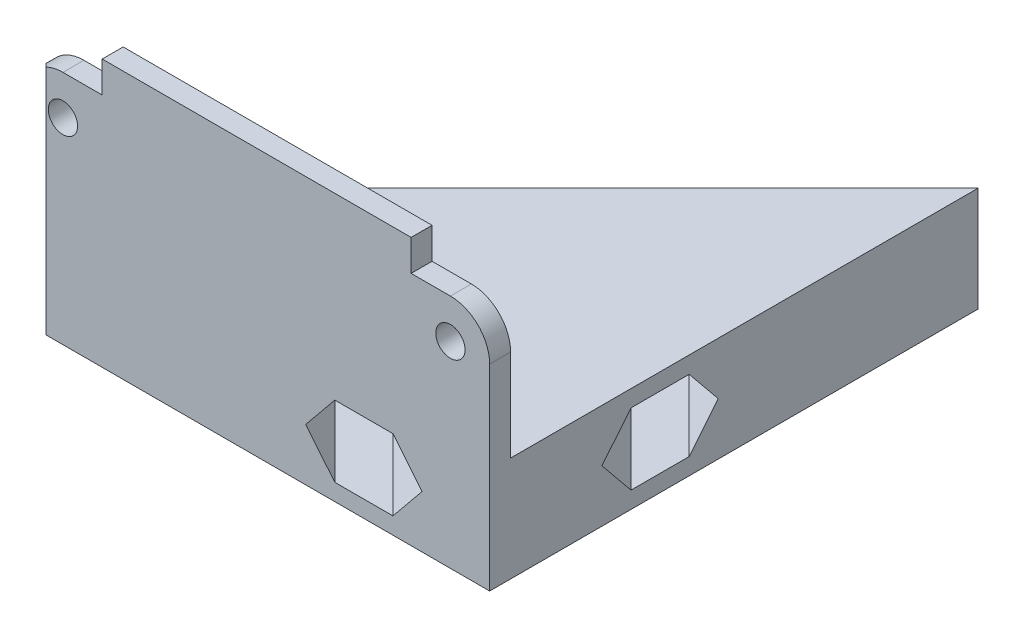
ISO-10303-21;
HEADER;
FILE_DESCRIPTION(('STEP AP214'),'2;1');
FILE_NAME('part.step','',(''),(''),'','','');
FILE_SCHEMA(('AUTOMOTIVE_DESIGN { 1 0 10303 214 1 1 1 1 }'));
ENDSEC;
DATA;
#1=APPLICATION_CONTEXT('core data for automotive mechanical design processes');
#2=APPLICATION_PROTOCOL_DEFINITION('international standard','automotive_design',2000,#1);
#3=PRODUCT_CONTEXT('',#1,'mechanical');
#4=PRODUCT('Part','Part','',(#3));
#5=PRODUCT_RELATED_PRODUCT_CATEGORY('part','',(#4));
#6=PRODUCT_DEFINITION_FORMATION('','',#4);
#7=PRODUCT_DEFINITION_CONTEXT('part definition',#1,'design');
#8=PRODUCT_DEFINITION('design','',#6,#7);
#9=PRODUCT_DEFINITION_SHAPE('','',#8);
#10=(LENGTH_UNIT() NAMED_UNIT(*) SI_UNIT(.MILLI.,.METRE.));
#11=(NAMED_UNIT(*) PLANE_ANGLE_UNIT() SI_UNIT($,.RADIAN.));
#12=(NAMED_UNIT(*) SI_UNIT($,.STERADIAN.) SOLID_ANGLE_UNIT());
#13=UNCERTAINTY_MEASURE_WITH_UNIT(LENGTH_MEASURE(1.E-05),#10,'distance_accuracy_value','');
#14=(GEOMETRIC_REPRESENTATION_CONTEXT(3) GLOBAL_UNCERTAINTY_ASSIGNED_CONTEXT((#13)) GLOBAL_UNIT_ASSIGNED_CONTEXT((#10,
#11,#12)) REPRESENTATION_CONTEXT('',''));
#15=CARTESIAN_POINT('',(0.,0.,0.));
#16=DIRECTION('',(0.,0.,1.));
#17=DIRECTION('',(1.,0.,0.));
#18=AXIS2_PLACEMENT_3D('',#15,#16,#17);
#19=CARTESIAN_POINT('',(3.75,6.27312353150441,2.));
#20=DIRECTION('',(0.,0.,-1.));
#21=DIRECTION('',(-1.,0.,0.));
#22=AXIS2_PLACEMENT_3D('',#19,#20,#21);
#23=CYLINDRICAL_SURFACE('',#22,3.75);
#24=CARTESIAN_POINT('',(3.75,6.27312353150441,0.));
#25=DIRECTION('',(0.,0.,1.));
#26=DIRECTION('',(1.,0.,0.));
#27=AXIS2_PLACEMENT_3D('',#24,#25,#26);
#28=CIRCLE('',#27,3.75);
#29=CARTESIAN_POINT('',(7.5,6.27312353150441,0.));
#30=VERTEX_POINT('',#29);
#31=CARTESIAN_POINT('',(3.75,10.0231235315044,0.));
#32=VERTEX_POINT('',#31);
#33=EDGE_CURVE('E258',#30,#32,#28,.T.);
#34=ORIENTED_EDGE('',*,*,#33,.T.);
#35=DIRECTION('',(0.,0.,-1.));
#36=VECTOR('',#35,1.);
#37=CARTESIAN_POINT('',(3.75,10.0231235315044,2.));
#38=LINE('',#37,#36);
#39=CARTESIAN_POINT('',(3.75,10.0231235315044,2.));
#40=VERTEX_POINT('',#39);
#41=EDGE_CURVE('E298',#40,#32,#38,.T.);
#42=ORIENTED_EDGE('',*,*,#41,.F.);
#43=CARTESIAN_POINT('',(3.75,6.27312353150441,2.));
#44=DIRECTION('',(0.,0.,1.));
#45=DIRECTION('',(1.,0.,0.));
#46=AXIS2_PLACEMENT_3D('',#43,#44,#45);
#47=CIRCLE('',#46,3.75);
#48=CARTESIAN_POINT('',(7.5,6.27312353150441,2.));
#49=VERTEX_POINT('',#48);
#50=EDGE_CURVE('E231',#49,#40,#47,.T.);
#51=ORIENTED_EDGE('',*,*,#50,.F.);
#52=DIRECTION('',(0.,0.,-1.));
#53=VECTOR('',#52,1.);
#54=CARTESIAN_POINT('',(7.5,6.27312353150441,2.));
#55=LINE('',#54,#53);
#56=EDGE_CURVE('E254',#49,#30,#55,.T.);
#57=ORIENTED_EDGE('',*,*,#56,.T.);
#58=EDGE_LOOP('',(#34,#42,#51,#57));
#59=FACE_BOUND('',#58,.T.);
#60=ADVANCED_FACE('F37',(#59),#23,.T.);
#61=CARTESIAN_POINT('',(0.,10.0231235315044,2.));
#62=DIRECTION('',(0.,-1.,0.));
#63=DIRECTION('',(1.,0.,0.));
#64=AXIS2_PLACEMENT_3D('',#61,#62,#63);
#65=PLANE('',#64);
#66=DIRECTION('',(-1.,0.,0.));
#67=VECTOR('',#66,1.);
#68=CARTESIAN_POINT('',(0.,10.0231235315044,0.));
#69=LINE('',#68,#67);
#70=CARTESIAN_POINT('',(0.,10.0231235315044,0.));
#71=VERTEX_POINT('',#70);
#72=EDGE_CURVE('E261',#32,#71,#69,.T.);
#73=ORIENTED_EDGE('',*,*,#72,.T.);
#74=DIRECTION('',(0.,0.,-1.));
#75=VECTOR('',#74,1.);
#76=CARTESIAN_POINT('',(0.,10.0231235315044,2.));
#77=LINE('',#76,#75);
#78=CARTESIAN_POINT('',(0.,10.0231235315044,2.));
#79=VERTEX_POINT('',#78);
#80=EDGE_CURVE('E295',#79,#71,#77,.T.);
#81=ORIENTED_EDGE('',*,*,#80,.F.);
#82=DIRECTION('',(-1.,0.,0.));
#83=VECTOR('',#82,1.);
#84=CARTESIAN_POINT('',(0.,10.0231235315044,2.));
#85=LINE('',#84,#83);
#86=EDGE_CURVE('E235',#40,#79,#85,.T.);
#87=ORIENTED_EDGE('',*,*,#86,.F.);
#88=ORIENTED_EDGE('',*,*,#41,.T.);
#89=EDGE_LOOP('',(#73,#81,#87,#88));
#90=FACE_BOUND('',#89,.T.);
#91=ADVANCED_FACE('F460',(#90),#65,.F.);
#92=CARTESIAN_POINT('',(0.,0.,2.));
#93=DIRECTION('',(-1.,0.,0.));
#94=DIRECTION('',(0.,-1.,0.));
#95=AXIS2_PLACEMENT_3D('',#92,#93,#94);
#96=PLANE('',#95);
#97=DIRECTION('',(0.,1.,0.));
#98=VECTOR('',#97,1.);
#99=CARTESIAN_POINT('',(0.,0.,0.));
#100=LINE('',#99,#98);
#101=CARTESIAN_POINT('',(0.,13.,0.));
#102=VERTEX_POINT('',#101);
#103=EDGE_CURVE('E263',#71,#102,#100,.T.);
#104=ORIENTED_EDGE('',*,*,#103,.T.);
#105=DIRECTION('',(0.,0.,-1.));
#106=VECTOR('',#105,1.);
#107=CARTESIAN_POINT('',(0.,13.,2.));
#108=LINE('',#107,#106);
#109=CARTESIAN_POINT('',(0.,13.,2.));
#110=VERTEX_POINT('',#109);
#111=EDGE_CURVE('E292',#110,#102,#108,.T.);
#112=ORIENTED_EDGE('',*,*,#111,.F.);
#113=DIRECTION('',(0.,1.,0.));
#114=VECTOR('',#113,1.);
#115=CARTESIAN_POINT('',(0.,0.,2.));
#116=LINE('',#115,#114);
#117=EDGE_CURVE('E237',#79,#110,#116,.T.);
#118=ORIENTED_EDGE('',*,*,#117,.F.);
#119=ORIENTED_EDGE('',*,*,#80,.T.);
#120=EDGE_LOOP('',(#104,#112,#118,#119));
#121=FACE_BOUND('',#120,.T.);
#122=ADVANCED_FACE('F464',(#121),#96,.F.);
#123=CARTESIAN_POINT('',(0.,13.,2.));
#124=DIRECTION('',(0.,-1.,0.));
#125=DIRECTION('',(1.,0.,0.));
#126=AXIS2_PLACEMENT_3D('',#123,#124,#125);
#127=PLANE('',#126);
#128=DIRECTION('',(-1.,0.,0.));
#129=VECTOR('',#128,1.);
#130=CARTESIAN_POINT('',(0.,13.,0.));
#131=LINE('',#130,#129);
#132=CARTESIAN_POINT('',(-29.5,13.0000000000001,0.));
#133=VERTEX_POINT('',#132);
#134=EDGE_CURVE('E265',#102,#133,#131,.T.);
#135=ORIENTED_EDGE('',*,*,#134,.T.);
#136=DIRECTION('',(0.,0.,-1.));
#137=VECTOR('',#136,1.);
#138=CARTESIAN_POINT('',(-29.5,13.0000000000001,2.));
#139=LINE('',#138,#137);
#140=CARTESIAN_POINT('',(-29.5,13.0000000000001,2.));
#141=VERTEX_POINT('',#140);
#142=EDGE_CURVE('E289',#141,#133,#139,.T.);
#143=ORIENTED_EDGE('',*,*,#142,.F.);
#144=DIRECTION('',(-1.,0.,0.));
#145=VECTOR('',#144,1.);
#146=CARTESIAN_POINT('',(0.,13.,2.));
#147=LINE('',#146,#145);
#148=EDGE_CURVE('E239',#110,#141,#147,.T.);
#149=ORIENTED_EDGE('',*,*,#148,.F.);
#150=ORIENTED_EDGE('',*,*,#111,.T.);
#151=EDGE_LOOP('',(#135,#143,#149,#150));
#152=FACE_BOUND('',#151,.T.);
#153=ADVANCED_FACE('F470',(#152),#127,.F.);
#154=CARTESIAN_POINT('',(-29.5,0.,2.));
#155=DIRECTION('',(1.,0.,0.));
#156=DIRECTION('',(0.,0.,-1.));
#157=AXIS2_PLACEMENT_3D('',#154,#155,#156);
#158=PLANE('',#157);
#159=DIRECTION('',(0.,-1.,0.));
#160=VECTOR('',#159,1.);
#161=CARTESIAN_POINT('',(-29.5,0.,0.));
#162=LINE('',#161,#160);
#163=CARTESIAN_POINT('',(-29.5,10.0231235315044,0.));
#164=VERTEX_POINT('',#163);
#165=EDGE_CURVE('E267',#133,#164,#162,.T.);
#166=ORIENTED_EDGE('',*,*,#165,.T.);
#167=DIRECTION('',(0.,0.,-1.));
#168=VECTOR('',#167,1.);
#169=CARTESIAN_POINT('',(-29.5,10.0231235315044,2.));
#170=LINE('',#169,#168);
#171=CARTESIAN_POINT('',(-29.5,10.0231235315044,2.));
#172=VERTEX_POINT('',#171);
#173=EDGE_CURVE('E286',#172,#164,#170,.T.);
#174=ORIENTED_EDGE('',*,*,#173,.F.);
#175=DIRECTION('',(0.,-1.,0.));
#176=VECTOR('',#175,1.);
#177=CARTESIAN_POINT('',(-29.5,0.,2.));
#178=LINE('',#177,#176);
#179=EDGE_CURVE('E241',#141,#172,#178,.T.);
#180=ORIENTED_EDGE('',*,*,#179,.F.);
#181=ORIENTED_EDGE('',*,*,#142,.T.);
#182=EDGE_LOOP('',(#166,#174,#180,#181));
#183=FACE_BOUND('',#182,.T.);
#184=ADVANCED_FACE('F474',(#183),#158,.F.);
#185=CARTESIAN_POINT('',(0.,10.0231235315044,2.));
#186=DIRECTION('',(0.,-1.,0.));
#187=DIRECTION('',(0.,0.,-1.));
#188=AXIS2_PLACEMENT_3D('',#185,#186,#187);
#189=PLANE('',#188);
#190=DIRECTION('',(-1.,0.,0.));
#191=VECTOR('',#190,1.);
#192=CARTESIAN_POINT('',(0.,10.0231235315044,0.));
#193=LINE('',#192,#191);
#194=CARTESIAN_POINT('',(-33.25,10.0231235315044,0.));
#195=VERTEX_POINT('',#194);
#196=EDGE_CURVE('E269',#164,#195,#193,.T.);
#197=ORIENTED_EDGE('',*,*,#196,.T.);
#198=DIRECTION('',(0.,0.,-1.));
#199=VECTOR('',#198,1.);
#200=CARTESIAN_POINT('',(-33.25,10.0231235315044,2.));
#201=LINE('',#200,#199);
#202=CARTESIAN_POINT('',(-33.25,10.0231235315044,2.));
#203=VERTEX_POINT('',#202);
#204=EDGE_CURVE('E283',#203,#195,#201,.T.);
#205=ORIENTED_EDGE('',*,*,#204,.F.);
#206=DIRECTION('',(-1.,0.,0.));
#207=VECTOR('',#206,1.);
#208=CARTESIAN_POINT('',(0.,10.0231235315044,2.));
#209=LINE('',#208,#207);
#210=EDGE_CURVE('E243',#172,#203,#209,.T.);
#211=ORIENTED_EDGE('',*,*,#210,.F.);
#212=ORIENTED_EDGE('',*,*,#173,.T.);
#213=EDGE_LOOP('',(#197,#205,#211,#212));
#214=FACE_BOUND('',#213,.T.);
#215=ADVANCED_FACE('F478',(#214),#189,.F.);
#216=CARTESIAN_POINT('',(-33.25,6.27312353150442,2.));
#217=DIRECTION('',(0.,0.,-1.));
#218=DIRECTION('',(-1.,0.,0.));
#219=AXIS2_PLACEMENT_3D('',#216,#217,#218);
#220=CYLINDRICAL_SURFACE('',#219,3.75);
#221=CARTESIAN_POINT('',(-33.25,6.27312353150442,0.));
#222=DIRECTION('',(0.,0.,1.));
#223=DIRECTION('',(1.,0.,0.));
#224=AXIS2_PLACEMENT_3D('',#221,#222,#223);
#225=CIRCLE('',#224,3.75);
#226=CARTESIAN_POINT('',(-36.8669047558321,7.26332552465492,0.));
#227=VERTEX_POINT('',#226);
#228=EDGE_CURVE('E271',#195,#227,#225,.T.);
#229=ORIENTED_EDGE('',*,*,#228,.T.);
#230=CARTESIAN_POINT('',(-33.25,6.27312353150442,3.61690475583207));
#231=DIRECTION('',(0.707106781186546,0.,-0.707106781186549));
#232=DIRECTION('',(-0.707106781186549,0.,-0.707106781186546));
#233=AXIS2_PLACEMENT_3D('',#230,#231,#232);
#234=ELLIPSE('',#233,5.30330085889909,3.75);
#235=CARTESIAN_POINT('',(-34.8669047558321,9.65663044158568,2.));
#236=VERTEX_POINT('',#235);
#237=EDGE_CURVE('E392',#227,#236,#234,.T.);
#238=ORIENTED_EDGE('',*,*,#237,.T.);
#239=CARTESIAN_POINT('',(-33.25,6.27312353150442,2.));
#240=DIRECTION('',(0.,0.,1.));
#241=DIRECTION('',(1.,0.,0.));
#242=AXIS2_PLACEMENT_3D('',#239,#240,#241);
#243=CIRCLE('',#242,3.75);
#244=EDGE_CURVE('E245',#203,#236,#243,.T.);
#245=ORIENTED_EDGE('',*,*,#244,.F.);
#246=ORIENTED_EDGE('',*,*,#204,.T.);
#247=EDGE_LOOP('',(#229,#238,#245,#246));
#248=FACE_BOUND('',#247,.T.);
#249=ADVANCED_FACE('F482',(#248),#220,.T.);
#250=CARTESIAN_POINT('',(7.5,0.,2.));
#251=DIRECTION('',(1.,0.,0.));
#252=DIRECTION('',(0.,1.,0.));
#253=AXIS2_PLACEMENT_3D('',#250,#251,#252);
#254=PLANE('',#253);
#255=DIRECTION('',(0.,-0.774596669241484,-0.632455532033675));
#256=VECTOR('',#255,1.);
#257=CARTESIAN_POINT('',(7.5,2.25233496776053,-0.75853570042066));
#258=LINE('',#257,#256);
#259=CARTESIAN_POINT('',(7.5,-7.50000000000102,-8.72128385765986));
#260=VERTEX_POINT('',#259);
#261=CARTESIAN_POINT('',(7.5,-10.900000000001,-11.4973722328141));
#262=VERTEX_POINT('',#261);
#263=EDGE_CURVE('E11',#260,#262,#258,.T.);
#264=ORIENTED_EDGE('',*,*,#263,.F.);
#265=DIRECTION('',(0.,-0.774596669241485,0.632455532033674));
#266=VECTOR('',#265,1.);
#267=CARTESIAN_POINT('',(7.5,-8.25233496776133,-8.1070049287712));
#268=LINE('',#267,#266);
#269=CARTESIAN_POINT('',(7.5,-4.10000000000102,-11.4973722328141));
#270=VERTEX_POINT('',#269);
#271=EDGE_CURVE('E313',#270,#260,#268,.T.);
#272=ORIENTED_EDGE('',*,*,#271,.F.);
#273=DIRECTION('',(0.,0.,1.));
#274=VECTOR('',#273,1.);
#275=CARTESIAN_POINT('',(7.5,-4.10000000000102,2.));
#276=LINE('',#275,#274);
#277=CARTESIAN_POINT('',(7.5,-4.10000000000102,-17.0495489831226));
#278=VERTEX_POINT('',#277);
#279=EDGE_CURVE('E315',#278,#270,#276,.T.);
#280=ORIENTED_EDGE('',*,*,#279,.F.);
#281=DIRECTION('',(0.,0.774596669241484,0.632455532033676));
#282=VECTOR('',#281,1.);
#283=CARTESIAN_POINT('',(7.5,7.69233496776051,-7.42114780079088));
#284=LINE('',#283,#282);
#285=CARTESIAN_POINT('',(7.5,-7.50000000000102,-19.8256373582769));
#286=VERTEX_POINT('',#285);
#287=EDGE_CURVE('E317',#286,#278,#284,.T.);
#288=ORIENTED_EDGE('',*,*,#287,.F.);
#289=DIRECTION('',(0.,0.774596669241484,-0.632455532033675));
#290=VECTOR('',#289,1.);
#291=CARTESIAN_POINT('',(7.5,-13.6923349677613,-14.7696170291414));
#292=LINE('',#291,#290);
#293=CARTESIAN_POINT('',(7.5,-10.900000000001,-17.0495489831226));
#294=VERTEX_POINT('',#293);
#295=EDGE_CURVE('E319',#294,#286,#292,.T.);
#296=ORIENTED_EDGE('',*,*,#295,.F.);
#297=DIRECTION('',(0.,0.,-1.));
#298=VECTOR('',#297,1.);
#299=CARTESIAN_POINT('',(7.5,-10.900000000001,2.));
#300=LINE('',#299,#298);
#301=EDGE_CURVE('E45',#262,#294,#300,.T.);
#302=ORIENTED_EDGE('',*,*,#301,.F.);
#303=EDGE_LOOP('',(#264,#272,#280,#288,#296,#302));
#304=FACE_BOUND('',#303,.T.);
#305=DIRECTION('',(0.,-1.,0.));
#306=VECTOR('',#305,1.);
#307=CARTESIAN_POINT('',(7.5,0.,0.));
#308=LINE('',#307,#306);
#309=CARTESIAN_POINT('',(7.5,-2.50000000000103,0.));
#310=VERTEX_POINT('',#309);
#311=EDGE_CURVE('E277',#30,#310,#308,.T.);
#312=ORIENTED_EDGE('',*,*,#311,.F.);
#313=ORIENTED_EDGE('',*,*,#56,.F.);
#314=DIRECTION('',(0.,-1.,0.));
#315=VECTOR('',#314,1.);
#316=CARTESIAN_POINT('',(7.5,0.,2.));
#317=LINE('',#316,#315);
#318=CARTESIAN_POINT('',(7.5,-12.500000000001,2.));
#319=VERTEX_POINT('',#318);
#320=EDGE_CURVE('E248',#49,#319,#317,.T.);
#321=ORIENTED_EDGE('',*,*,#320,.T.);
#322=DIRECTION('',(0.,0.,1.));
#323=VECTOR('',#322,1.);
#324=CARTESIAN_POINT('',(7.5,-12.500000000001,-77.4389430858217));
#325=LINE('',#324,#323);
#326=CARTESIAN_POINT('',(7.5,-12.500000000001,-44.6330952441681));
#327=VERTEX_POINT('',#326);
#328=EDGE_CURVE('E220',#327,#319,#325,.T.);
#329=ORIENTED_EDGE('',*,*,#328,.F.);
#330=DIRECTION('',(0.,1.,0.));
#331=VECTOR('',#330,1.);
#332=CARTESIAN_POINT('',(7.5,0.,-44.6330952441681));
#333=LINE('',#332,#331);
#334=CARTESIAN_POINT('',(7.50000000000005,-2.5000000000012,-44.6330952441681));
#335=VERTEX_POINT('',#334);
#336=EDGE_CURVE('E219',#327,#335,#333,.T.);
#337=ORIENTED_EDGE('',*,*,#336,.T.);
#338=DIRECTION('',(0.,0.,1.));
#339=VECTOR('',#338,1.);
#340=CARTESIAN_POINT('',(7.5,-2.50000000000103,-77.4389430858217));
#341=LINE('',#340,#339);
#342=EDGE_CURVE('E221',#335,#310,#341,.T.);
#343=ORIENTED_EDGE('',*,*,#342,.T.);
#344=EDGE_LOOP('',(#312,#313,#321,#329,#337,#343));
#345=FACE_BOUND('',#344,.T.);
#346=ADVANCED_FACE('F341',(#304,#345),#254,.T.);
#347=CARTESIAN_POINT('',(3.75,6.27312353150441,2.));
#348=DIRECTION('',(0.,0.,-1.));
#349=DIRECTION('',(-1.,0.,0.));
#350=AXIS2_PLACEMENT_3D('',#347,#348,#349);
#351=CYLINDRICAL_SURFACE('',#350,1.4);
#352=CARTESIAN_POINT('',(3.75,6.27312353150441,2.));
#353=DIRECTION('',(0.,0.,1.));
#354=DIRECTION('',(1.,0.,0.));
#355=AXIS2_PLACEMENT_3D('',#352,#353,#354);
#356=CIRCLE('',#355,1.4);
#357=CARTESIAN_POINT('',(5.15,6.27312353150441,2.));
#358=VERTEX_POINT('',#357);
#359=EDGE_CURVE('E228',#358,#358,#356,.T.);
#360=ORIENTED_EDGE('',*,*,#359,.T.);
#361=EDGE_LOOP('',(#360));
#362=FACE_BOUND('',#361,.T.);
#363=CARTESIAN_POINT('',(3.75,6.27312353150441,0.));
#364=DIRECTION('',(0.,0.,1.));
#365=DIRECTION('',(1.,0.,0.));
#366=AXIS2_PLACEMENT_3D('',#363,#364,#365);
#367=CIRCLE('',#366,1.4);
#368=CARTESIAN_POINT('',(5.15,6.27312353150441,0.));
#369=VERTEX_POINT('',#368);
#370=EDGE_CURVE('E255',#369,#369,#367,.T.);
#371=ORIENTED_EDGE('',*,*,#370,.F.);
#372=EDGE_LOOP('',(#371));
#373=FACE_BOUND('',#372,.T.);
#374=ADVANCED_FACE('F39',(#362,#373),#351,.F.);
#375=CARTESIAN_POINT('',(-33.25,6.27312353150442,2.));
#376=DIRECTION('',(0.,0.,-1.));
#377=DIRECTION('',(-1.,0.,0.));
#378=AXIS2_PLACEMENT_3D('',#375,#376,#377);
#379=CYLINDRICAL_SURFACE('',#378,1.4);
#380=CARTESIAN_POINT('',(-33.25,6.27312353150442,2.));
#381=DIRECTION('',(0.,0.,1.));
#382=DIRECTION('',(1.,0.,0.));
#383=AXIS2_PLACEMENT_3D('',#380,#381,#382);
#384=CIRCLE('',#383,1.4);
#385=CARTESIAN_POINT('',(-31.85,6.27312353150442,2.));
#386=VERTEX_POINT('',#385);
#387=EDGE_CURVE('E251',#386,#386,#384,.T.);
#388=ORIENTED_EDGE('',*,*,#387,.T.);
#389=EDGE_LOOP('',(#388));
#390=FACE_BOUND('',#389,.T.);
#391=CARTESIAN_POINT('',(-33.25,6.27312353150442,0.));
#392=DIRECTION('',(0.,0.,1.));
#393=DIRECTION('',(1.,0.,0.));
#394=AXIS2_PLACEMENT_3D('',#391,#392,#393);
#395=CIRCLE('',#394,1.4);
#396=CARTESIAN_POINT('',(-31.85,6.27312353150442,0.));
#397=VERTEX_POINT('',#396);
#398=EDGE_CURVE('E232',#397,#397,#395,.T.);
#399=ORIENTED_EDGE('',*,*,#398,.F.);
#400=EDGE_LOOP('',(#399));
#401=FACE_BOUND('',#400,.T.);
#402=ADVANCED_FACE('F489',(#390,#401),#379,.F.);
#403=CARTESIAN_POINT('',(0.,0.,2.));
#404=DIRECTION('',(0.,0.,1.));
#405=DIRECTION('',(1.,0.,0.));
#406=AXIS2_PLACEMENT_3D('',#403,#404,#405);
#407=PLANE('',#406);
#408=DIRECTION('',(0.,1.,0.));
#409=VECTOR('',#408,1.);
#410=CARTESIAN_POINT('',(-34.8669047558321,0.,2.));
#411=LINE('',#410,#409);
#412=CARTESIAN_POINT('',(-34.8669047558321,-12.500000000001,2.00000000000001));
#413=VERTEX_POINT('',#412);
#414=EDGE_CURVE('E388',#413,#236,#411,.T.);
#415=ORIENTED_EDGE('',*,*,#414,.F.);
#416=DIRECTION('',(1.,0.,0.));
#417=VECTOR('',#416,1.);
#418=CARTESIAN_POINT('',(0.,-12.500000000001,2.));
#419=LINE('',#418,#417);
#420=EDGE_CURVE('E207',#413,#319,#419,.T.);
#421=ORIENTED_EDGE('',*,*,#420,.T.);
#422=ORIENTED_EDGE('',*,*,#320,.F.);
#423=ORIENTED_EDGE('',*,*,#50,.T.);
#424=ORIENTED_EDGE('',*,*,#86,.T.);
#425=ORIENTED_EDGE('',*,*,#117,.T.);
#426=ORIENTED_EDGE('',*,*,#148,.T.);
#427=ORIENTED_EDGE('',*,*,#179,.T.);
#428=ORIENTED_EDGE('',*,*,#210,.T.);
#429=ORIENTED_EDGE('',*,*,#244,.T.);
#430=EDGE_LOOP('',(#415,#421,#422,#423,#424,#425,#426,#427,#428,#429));
#431=FACE_BOUND('',#430,.T.);
#432=DIRECTION('',(0.632455532033677,-0.774596669241483,0.));
#433=VECTOR('',#432,1.);
#434=CARTESIAN_POINT('',(-9.7120270480565,-7.92983687861574,2.));
#435=LINE('',#434,#433);
#436=CARTESIAN_POINT('',(-10.0629873898021,-7.50000000000102,2.));
#437=VERTEX_POINT('',#436);
#438=CARTESIAN_POINT('',(-7.28689901464779,-10.900000000001,2.));
#439=VERTEX_POINT('',#438);
#440=EDGE_CURVE('E311',#437,#439,#435,.T.);
#441=ORIENTED_EDGE('',*,*,#440,.F.);
#442=DIRECTION('',(-0.632455532033677,-0.774596669241482,0.));
#443=VECTOR('',#442,1.);
#444=CARTESIAN_POINT('',(-2.36355781970595,1.9298368786149,2.));
#445=LINE('',#444,#443);
#446=CARTESIAN_POINT('',(-7.28689901464778,-4.10000000000103,2.));
#447=VERTEX_POINT('',#446);
#448=EDGE_CURVE('E301',#447,#437,#445,.T.);
#449=ORIENTED_EDGE('',*,*,#448,.F.);
#450=DIRECTION('',(-1.,0.,0.));
#451=VECTOR('',#450,1.);
#452=CARTESIAN_POINT('',(0.,-4.10000000000103,2.));
#453=LINE('',#452,#451);
#454=CARTESIAN_POINT('',(-1.73472226433923,-4.10000000000103,2.));
#455=VERTEX_POINT('',#454);
#456=EDGE_CURVE('E303',#455,#447,#453,.T.);
#457=ORIENTED_EDGE('',*,*,#456,.F.);
#458=DIRECTION('',(-0.632455532033677,0.774596669241483,0.));
#459=VECTOR('',#458,1.);
#460=CARTESIAN_POINT('',(-3.04941494768625,-2.48983687861573,2.));
#461=LINE('',#460,#459);
#462=CARTESIAN_POINT('',(1.04136611081504,-7.50000000000102,2.));
#463=VERTEX_POINT('',#462);
#464=EDGE_CURVE('E305',#463,#455,#461,.T.);
#465=ORIENTED_EDGE('',*,*,#464,.F.);
#466=DIRECTION('',(0.632455532033677,0.774596669241482,0.));
#467=VECTOR('',#466,1.);
#468=CARTESIAN_POINT('',(4.29905428066429,-3.51016312138511,2.));
#469=LINE('',#468,#467);
#470=CARTESIAN_POINT('',(-1.73472226433923,-10.900000000001,2.));
#471=VERTEX_POINT('',#470);
#472=EDGE_CURVE('E307',#471,#463,#469,.T.);
#473=ORIENTED_EDGE('',*,*,#472,.F.);
#474=DIRECTION('',(1.,0.,0.));
#475=VECTOR('',#474,1.);
#476=CARTESIAN_POINT('',(0.,-10.900000000001,2.));
#477=LINE('',#476,#475);
#478=EDGE_CURVE('E309',#439,#471,#477,.T.);
#479=ORIENTED_EDGE('',*,*,#478,.F.);
#480=EDGE_LOOP('',(#441,#449,#457,#465,#473,#479));
#481=FACE_BOUND('',#480,.T.);
#482=ORIENTED_EDGE('',*,*,#359,.F.);
#483=EDGE_LOOP('',(#482));
#484=FACE_BOUND('',#483,.T.);
#485=ORIENTED_EDGE('',*,*,#387,.F.);
#486=EDGE_LOOP('',(#485));
#487=FACE_BOUND('',#486,.T.);
#488=ADVANCED_FACE('F386',(#431,#481,#484,#487),#407,.T.);
#489=CARTESIAN_POINT('',(0.,0.,0.));
#490=DIRECTION('',(0.,0.,1.));
#491=DIRECTION('',(1.,0.,0.));
#492=AXIS2_PLACEMENT_3D('',#489,#490,#491);
#493=PLANE('',#492);
#494=ORIENTED_EDGE('',*,*,#370,.T.);
#495=EDGE_LOOP('',(#494));
#496=FACE_BOUND('',#495,.T.);
#497=DIRECTION('',(-1.,0.,0.));
#498=VECTOR('',#497,1.);
#499=CARTESIAN_POINT('',(0.,-2.50000000000103,0.));
#500=LINE('',#499,#498);
#501=CARTESIAN_POINT('',(-36.8669047558321,-2.50000000000103,0.));
#502=VERTEX_POINT('',#501);
#503=EDGE_CURVE('E274',#310,#502,#500,.T.);
#504=ORIENTED_EDGE('',*,*,#503,.T.);
#505=DIRECTION('',(0.,1.,0.));
#506=VECTOR('',#505,1.);
#507=CARTESIAN_POINT('',(-36.8669047558321,0.,0.));
#508=LINE('',#507,#506);
#509=EDGE_CURVE('E379',#502,#227,#508,.T.);
#510=ORIENTED_EDGE('',*,*,#509,.T.);
#511=ORIENTED_EDGE('',*,*,#228,.F.);
#512=ORIENTED_EDGE('',*,*,#196,.F.);
#513=ORIENTED_EDGE('',*,*,#165,.F.);
#514=ORIENTED_EDGE('',*,*,#134,.F.);
#515=ORIENTED_EDGE('',*,*,#103,.F.);
#516=ORIENTED_EDGE('',*,*,#72,.F.);
#517=ORIENTED_EDGE('',*,*,#33,.F.);
#518=ORIENTED_EDGE('',*,*,#311,.T.);
#519=EDGE_LOOP('',(#504,#510,#511,#512,#513,#514,#515,#516,#517,#518));
#520=FACE_BOUND('',#519,.T.);
#521=ORIENTED_EDGE('',*,*,#398,.T.);
#522=EDGE_LOOP('',(#521));
#523=FACE_BOUND('',#522,.T.);
#524=ADVANCED_FACE('F376',(#496,#520,#523),#493,.F.);
#525=CARTESIAN_POINT('',(0.,-12.500000000001,-77.4389430858217));
#526=DIRECTION('',(0.,-1.,0.));
#527=DIRECTION('',(1.,0.,0.));
#528=AXIS2_PLACEMENT_3D('',#525,#526,#527);
#529=PLANE('',#528);
#530=DIRECTION('',(-0.707106781186549,0.,-0.707106781186546));
#531=VECTOR('',#530,1.);
#532=CARTESIAN_POINT('',(-13.6834523779159,-12.500000000001,23.1834523779161));
#533=LINE('',#532,#531);
#534=CARTESIAN_POINT('',(-37.,-12.500000000001,-0.133095244167908));
#535=VERTEX_POINT('',#534);
#536=EDGE_CURVE('E199',#413,#535,#533,.T.);
#537=ORIENTED_EDGE('',*,*,#536,.T.);
#538=DIRECTION('',(0.707106781186546,0.,-0.707106781186549));
#539=VECTOR('',#538,1.);
#540=CARTESIAN_POINT('',(20.1529239208268,-12.500000000001,-57.286019164995));
#541=LINE('',#540,#539);
#542=EDGE_CURVE('E214',#535,#327,#541,.T.);
#543=ORIENTED_EDGE('',*,*,#542,.T.);
#544=ORIENTED_EDGE('',*,*,#328,.T.);
#545=ORIENTED_EDGE('',*,*,#420,.F.);
#546=EDGE_LOOP('',(#537,#543,#544,#545));
#547=FACE_BOUND('',#546,.T.);
#548=ADVANCED_FACE('F212',(#547),#529,.T.);
#549=CARTESIAN_POINT('',(0.,-2.50000000000103,-77.4389430858217));
#550=DIRECTION('',(0.,-1.,0.));
#551=DIRECTION('',(0.,0.,-1.));
#552=AXIS2_PLACEMENT_3D('',#549,#550,#551);
#553=PLANE('',#552);
#554=DIRECTION('',(0.707106781186546,0.,-0.707106781186549));
#555=VECTOR('',#554,1.);
#556=CARTESIAN_POINT('',(20.1529239208268,-2.50000000000103,-57.286019164995));
#557=LINE('',#556,#555);
#558=CARTESIAN_POINT('',(-37.,-2.50000000000103,-0.133095244167908));
#559=VERTEX_POINT('',#558);
#560=EDGE_CURVE('E206',#559,#335,#557,.T.);
#561=ORIENTED_EDGE('',*,*,#560,.F.);
#562=DIRECTION('',(0.707106781186549,0.,0.707106781186546));
#563=VECTOR('',#562,1.);
#564=CARTESIAN_POINT('',(-57.1529239208268,-2.50000000000103,-20.2860191649946));
#565=LINE('',#564,#563);
#566=EDGE_CURVE('E202',#559,#502,#565,.T.);
#567=ORIENTED_EDGE('',*,*,#566,.T.);
#568=ORIENTED_EDGE('',*,*,#503,.F.);
#569=ORIENTED_EDGE('',*,*,#342,.F.);
#570=EDGE_LOOP('',(#561,#567,#568,#569));
#571=FACE_BOUND('',#570,.T.);
#572=ADVANCED_FACE('F373',(#571),#553,.F.);
#573=CARTESIAN_POINT('',(120.678335192424,-67.2999999999979,-157.811430436593));
#574=DIRECTION('',(-0.707106781186549,0.,-0.707106781186546));
#575=DIRECTION('',(-0.707106781186545,0.,0.70710678118655));
#576=AXIS2_PLACEMENT_3D('',#573,#574,#575);
#577=PLANE('',#576);
#578=CARTESIAN_POINT('',(-7.67981731809987,-7.50000000000103,-29.4532779260682));
#579=DIRECTION('',(-0.707106781186549,0.,-0.707106781186546));
#580=DIRECTION('',(-0.707106781186546,0.,0.707106781186549));
#581=AXIS2_PLACEMENT_3D('',#578,#579,#580);
#582=CIRCLE('',#581,2.);
#583=CARTESIAN_POINT('',(-9.09403088047296,-7.50000000000103,-28.0390643636951));
#584=VERTEX_POINT('',#583);
#585=EDGE_CURVE('E363',#584,#584,#582,.T.);
#586=ORIENTED_EDGE('',*,*,#585,.F.);
#587=EDGE_LOOP('',(#586));
#588=FACE_BOUND('',#587,.T.);
#589=CARTESIAN_POINT('',(-21.8219529418308,-7.50000000000103,-15.3111423023372));
#590=DIRECTION('',(-0.707106781186549,0.,-0.707106781186546));
#591=DIRECTION('',(-0.707106781186546,0.,0.707106781186549));
#592=AXIS2_PLACEMENT_3D('',#589,#590,#591);
#593=CIRCLE('',#592,2.);
#594=CARTESIAN_POINT('',(-23.2361665042039,-7.50000000000103,-13.8969287399641));
#595=VERTEX_POINT('',#594);
#596=EDGE_CURVE('E366',#595,#595,#593,.T.);
#597=ORIENTED_EDGE('',*,*,#596,.F.);
#598=EDGE_LOOP('',(#597));
#599=FACE_BOUND('',#598,.T.);
#600=ORIENTED_EDGE('',*,*,#542,.F.);
#601=DIRECTION('',(0.,1.,0.));
#602=VECTOR('',#601,1.);
#603=CARTESIAN_POINT('',(-37.,0.,-0.133095244167908));
#604=LINE('',#603,#602);
#605=EDGE_CURVE('E196',#535,#559,#604,.T.);
#606=ORIENTED_EDGE('',*,*,#605,.T.);
#607=ORIENTED_EDGE('',*,*,#560,.T.);
#608=ORIENTED_EDGE('',*,*,#336,.F.);
#609=EDGE_LOOP('',(#600,#606,#607,#608));
#610=FACE_BOUND('',#609,.T.);
#611=ADVANCED_FACE('F217',(#588,#599,#610),#577,.T.);
#612=CARTESIAN_POINT('',(1.49459468025331,-7.50000000000102,8.00540531974678));
#613=DIRECTION('',(-0.70710678118655,0.,-0.707106781186546));
#614=DIRECTION('',(-0.707106781186546,0.,0.70710678118655));
#615=AXIS2_PLACEMENT_3D('',#612,#613,#614);
#616=CYLINDRICAL_SURFACE('',#615,2.);
#617=CARTESIAN_POINT('',(-18.9935258170846,-7.50000000000103,-12.482715177591));
#618=DIRECTION('',(-0.707106781186549,0.,-0.707106781186546));
#619=DIRECTION('',(-0.707106781186546,0.,0.707106781186549));
#620=AXIS2_PLACEMENT_3D('',#617,#618,#619);
#621=CIRCLE('',#620,2.);
#622=CARTESIAN_POINT('',(-20.4077393794577,-7.50000000000103,-11.0685016152179));
#623=VERTEX_POINT('',#622);
#624=EDGE_CURVE('E391',#623,#623,#621,.T.);
#625=ORIENTED_EDGE('',*,*,#624,.F.);
#626=EDGE_LOOP('',(#625));
#627=FACE_BOUND('',#626,.T.);
#628=ORIENTED_EDGE('',*,*,#596,.T.);
#629=EDGE_LOOP('',(#628));
#630=FACE_BOUND('',#629,.T.);
#631=ADVANCED_FACE('F500',(#627,#630),#616,.F.);
#632=CARTESIAN_POINT('',(15.6367303039842,-7.50000000000102,-6.1367303039842));
#633=DIRECTION('',(-0.70710678118655,0.,-0.707106781186546));
#634=DIRECTION('',(-0.707106781186546,0.,0.70710678118655));
#635=AXIS2_PLACEMENT_3D('',#632,#633,#634);
#636=CYLINDRICAL_SURFACE('',#635,2.);
#637=CARTESIAN_POINT('',(-4.85139019335368,-7.50000000000103,-26.624850801322));
#638=DIRECTION('',(-0.707106781186549,0.,-0.707106781186546));
#639=DIRECTION('',(-0.707106781186546,0.,0.707106781186549));
#640=AXIS2_PLACEMENT_3D('',#637,#638,#639);
#641=CIRCLE('',#640,2.);
#642=CARTESIAN_POINT('',(-6.26560375572677,-7.50000000000103,-25.2106372389489));
#643=VERTEX_POINT('',#642);
#644=EDGE_CURVE('E419',#643,#643,#641,.T.);
#645=ORIENTED_EDGE('',*,*,#644,.F.);
#646=EDGE_LOOP('',(#645));
#647=FACE_BOUND('',#646,.T.);
#648=ORIENTED_EDGE('',*,*,#585,.T.);
#649=EDGE_LOOP('',(#648));
#650=FACE_BOUND('',#649,.T.);
#651=ADVANCED_FACE('F508',(#647,#650),#636,.F.);
#652=CARTESIAN_POINT('',(14.2486861164071,-10.900000000001,-4.74868611640706));
#653=DIRECTION('',(-0.612372435695793,-0.5,0.612372435695796));
#654=DIRECTION('',(0.70710678118655,0.,0.707106781186545));
#655=AXIS2_PLACEMENT_3D('',#652,#653,#654);
#656=PLANE('',#655);
#657=ORIENTED_EDGE('',*,*,#263,.T.);
#658=DIRECTION('',(-0.707106781186549,0.,-0.707106781186546));
#659=VECTOR('',#658,1.);
#660=CARTESIAN_POINT('',(14.2486861164071,-10.900000000001,-4.74868611640706));
#661=LINE('',#660,#659);
#662=CARTESIAN_POINT('',(-6.23943438093082,-10.900000000001,-25.2368066137449));
#663=VERTEX_POINT('',#662);
#664=EDGE_CURVE('E328',#262,#663,#661,.T.);
#665=ORIENTED_EDGE('',*,*,#664,.T.);
#666=DIRECTION('',(-0.353553390593273,0.866025403784439,0.353553390593274));
#667=VECTOR('',#666,1.);
#668=CARTESIAN_POINT('',(-6.23943438093082,-10.900000000001,-25.2368066137449));
#669=LINE('',#668,#667);
#670=CARTESIAN_POINT('',(-7.62747856850795,-7.50000000000103,-23.8487624261677));
#671=VERTEX_POINT('',#670);
#672=EDGE_CURVE('E430',#663,#671,#669,.T.);
#673=ORIENTED_EDGE('',*,*,#672,.T.);
#674=DIRECTION('',(-0.707106781186549,0.,-0.707106781186546));
#675=VECTOR('',#674,1.);
#676=CARTESIAN_POINT('',(12.86064192883,-7.50000000000102,-3.36064192882993));
#677=LINE('',#676,#675);
#678=EDGE_CURVE('E358',#260,#671,#677,.T.);
#679=ORIENTED_EDGE('',*,*,#678,.F.);
#680=EDGE_LOOP('',(#657,#665,#673,#679));
#681=FACE_BOUND('',#680,.T.);
#682=ADVANCED_FACE('F442',(#681),#656,.F.);
#683=CARTESIAN_POINT('',(17.0247744915613,-10.900000000001,-7.52477449156134));
#684=DIRECTION('',(0.,-1.,0.));
#685=DIRECTION('',(1.,0.,0.));
#686=AXIS2_PLACEMENT_3D('',#683,#684,#685);
#687=PLANE('',#686);
#688=ORIENTED_EDGE('',*,*,#301,.T.);
#689=DIRECTION('',(-0.707106781186549,0.,-0.707106781186546));
#690=VECTOR('',#689,1.);
#691=CARTESIAN_POINT('',(17.0247744915613,-10.900000000001,-7.52477449156134));
#692=LINE('',#691,#690);
#693=CARTESIAN_POINT('',(-3.46334600577655,-10.900000000001,-28.0128949888991));
#694=VERTEX_POINT('',#693);
#695=EDGE_CURVE('E326',#294,#694,#692,.T.);
#696=ORIENTED_EDGE('',*,*,#695,.T.);
#697=DIRECTION('',(-0.707106781186545,0.,0.70710678118655));
#698=VECTOR('',#697,1.);
#699=CARTESIAN_POINT('',(-3.46334600577655,-10.900000000001,-28.0128949888991));
#700=LINE('',#699,#698);
#701=EDGE_CURVE('E362',#694,#663,#700,.T.);
#702=ORIENTED_EDGE('',*,*,#701,.T.);
#703=ORIENTED_EDGE('',*,*,#664,.F.);
#704=EDGE_LOOP('',(#688,#696,#702,#703));
#705=FACE_BOUND('',#704,.T.);
#706=ADVANCED_FACE('F324',(#705),#687,.F.);
#707=CARTESIAN_POINT('',(18.4128186791385,-7.50000000000102,-8.91281867913848));
#708=DIRECTION('',(0.612372435695793,-0.5,-0.612372435695796));
#709=DIRECTION('',(-0.707106781186549,0.,-0.707106781186546));
#710=AXIS2_PLACEMENT_3D('',#707,#708,#709);
#711=PLANE('',#710);
#712=ORIENTED_EDGE('',*,*,#295,.T.);
#713=DIRECTION('',(-0.707106781186549,0.,-0.707106781186546));
#714=VECTOR('',#713,1.);
#715=CARTESIAN_POINT('',(18.4128186791385,-7.50000000000102,-8.91281867913848));
#716=LINE('',#715,#714);
#717=CARTESIAN_POINT('',(-2.07530181819942,-7.50000000000102,-29.4009391764763));
#718=VERTEX_POINT('',#717);
#719=EDGE_CURVE('E338',#286,#718,#716,.T.);
#720=ORIENTED_EDGE('',*,*,#719,.T.);
#721=DIRECTION('',(-0.353553390593273,-0.866025403784439,0.353553390593275));
#722=VECTOR('',#721,1.);
#723=CARTESIAN_POINT('',(-2.07530181819942,-7.50000000000102,-29.4009391764763));
#724=LINE('',#723,#722);
#725=EDGE_CURVE('E336',#718,#694,#724,.T.);
#726=ORIENTED_EDGE('',*,*,#725,.T.);
#727=ORIENTED_EDGE('',*,*,#695,.F.);
#728=EDGE_LOOP('',(#712,#720,#726,#727));
#729=FACE_BOUND('',#728,.T.);
#730=ADVANCED_FACE('F333',(#729),#711,.F.);
#731=CARTESIAN_POINT('',(17.0247744915613,-4.10000000000102,-7.52477449156134));
#732=DIRECTION('',(0.612372435695792,0.500000000000001,-0.612372435695796));
#733=DIRECTION('',(-0.707106781186549,0.,-0.707106781186546));
#734=AXIS2_PLACEMENT_3D('',#731,#732,#733);
#735=PLANE('',#734);
#736=ORIENTED_EDGE('',*,*,#287,.T.);
#737=DIRECTION('',(-0.707106781186549,0.,-0.707106781186546));
#738=VECTOR('',#737,1.);
#739=CARTESIAN_POINT('',(17.0247744915613,-4.10000000000102,-7.52477449156134));
#740=LINE('',#739,#738);
#741=CARTESIAN_POINT('',(-3.46334600577655,-4.10000000000103,-28.0128949888991));
#742=VERTEX_POINT('',#741);
#743=EDGE_CURVE('E349',#278,#742,#740,.T.);
#744=ORIENTED_EDGE('',*,*,#743,.T.);
#745=DIRECTION('',(0.353553390593273,-0.866025403784438,-0.353553390593275));
#746=VECTOR('',#745,1.);
#747=CARTESIAN_POINT('',(-3.46334600577655,-4.10000000000103,-28.0128949888991));
#748=LINE('',#747,#746);
#749=EDGE_CURVE('E436',#742,#718,#748,.T.);
#750=ORIENTED_EDGE('',*,*,#749,.T.);
#751=ORIENTED_EDGE('',*,*,#719,.F.);
#752=EDGE_LOOP('',(#736,#744,#750,#751));
#753=FACE_BOUND('',#752,.T.);
#754=ADVANCED_FACE('F347',(#753),#735,.F.);
#755=CARTESIAN_POINT('',(14.2486861164071,-4.10000000000102,-4.74868611640706));
#756=DIRECTION('',(0.,1.,0.));
#757=DIRECTION('',(-1.,0.,0.));
#758=AXIS2_PLACEMENT_3D('',#755,#756,#757);
#759=PLANE('',#758);
#760=ORIENTED_EDGE('',*,*,#279,.T.);
#761=DIRECTION('',(-0.707106781186549,0.,-0.707106781186546));
#762=VECTOR('',#761,1.);
#763=CARTESIAN_POINT('',(14.2486861164071,-4.10000000000102,-4.74868611640706));
#764=LINE('',#763,#762);
#765=CARTESIAN_POINT('',(-6.23943438093082,-4.10000000000103,-25.2368066137449));
#766=VERTEX_POINT('',#765);
#767=EDGE_CURVE('E52',#270,#766,#764,.T.);
#768=ORIENTED_EDGE('',*,*,#767,.T.);
#769=DIRECTION('',(0.707106781186545,0.,-0.70710678118655));
#770=VECTOR('',#769,1.);
#771=CARTESIAN_POINT('',(-6.23943438093082,-4.10000000000103,-25.2368066137449));
#772=LINE('',#771,#770);
#773=EDGE_CURVE('E355',#766,#742,#772,.T.);
#774=ORIENTED_EDGE('',*,*,#773,.T.);
#775=ORIENTED_EDGE('',*,*,#743,.F.);
#776=EDGE_LOOP('',(#760,#768,#774,#775));
#777=FACE_BOUND('',#776,.T.);
#778=ADVANCED_FACE('F353',(#777),#759,.F.);
#779=CARTESIAN_POINT('',(12.86064192883,-7.50000000000102,-3.36064192882993));
#780=DIRECTION('',(-0.612372435695793,0.5,0.612372435695796));
#781=DIRECTION('',(0.707106781186549,0.,0.707106781186546));
#782=AXIS2_PLACEMENT_3D('',#779,#780,#781);
#783=PLANE('',#782);
#784=ORIENTED_EDGE('',*,*,#271,.T.);
#785=ORIENTED_EDGE('',*,*,#678,.T.);
#786=DIRECTION('',(0.353553390593273,0.866025403784439,-0.353553390593274));
#787=VECTOR('',#786,1.);
#788=CARTESIAN_POINT('',(-7.62747856850795,-7.50000000000103,-23.8487624261677));
#789=LINE('',#788,#787);
#790=EDGE_CURVE('E433',#671,#766,#789,.T.);
#791=ORIENTED_EDGE('',*,*,#790,.T.);
#792=ORIENTED_EDGE('',*,*,#767,.F.);
#793=EDGE_LOOP('',(#784,#785,#791,#792));
#794=FACE_BOUND('',#793,.T.);
#795=ADVANCED_FACE('F447',(#794),#783,.F.);
#796=CARTESIAN_POINT('',(-15.7381204973378,0.,-15.7381204973378));
#797=DIRECTION('',(-0.707106781186549,0.,-0.707106781186546));
#798=DIRECTION('',(-0.707106781186546,0.,0.707106781186549));
#799=AXIS2_PLACEMENT_3D('',#796,#797,#798);
#800=PLANE('',#799);
#801=ORIENTED_EDGE('',*,*,#644,.T.);
#802=EDGE_LOOP('',(#801));
#803=FACE_BOUND('',#802,.T.);
#804=ORIENTED_EDGE('',*,*,#672,.F.);
#805=ORIENTED_EDGE('',*,*,#701,.F.);
#806=ORIENTED_EDGE('',*,*,#725,.F.);
#807=ORIENTED_EDGE('',*,*,#749,.F.);
#808=ORIENTED_EDGE('',*,*,#773,.F.);
#809=ORIENTED_EDGE('',*,*,#790,.F.);
#810=EDGE_LOOP('',(#804,#805,#806,#807,#808,#809));
#811=FACE_BOUND('',#810,.T.);
#812=ADVANCED_FACE('F446',(#803,#811),#800,.F.);
#813=CARTESIAN_POINT('',(0.106550492676175,-10.900000000001,9.39344950732392));
#814=DIRECTION('',(-0.612372435695793,-0.5,0.612372435695796));
#815=DIRECTION('',(0.70710678118655,0.,0.707106781186545));
#816=AXIS2_PLACEMENT_3D('',#813,#814,#815);
#817=PLANE('',#816);
#818=ORIENTED_EDGE('',*,*,#440,.T.);
#819=DIRECTION('',(-0.707106781186549,0.,-0.707106781186546));
#820=VECTOR('',#819,1.);
#821=CARTESIAN_POINT('',(0.106550492676175,-10.900000000001,9.39344950732392));
#822=LINE('',#821,#820);
#823=CARTESIAN_POINT('',(-20.3815700046617,-10.900000000001,-11.0946709900139));
#824=VERTEX_POINT('',#823);
#825=EDGE_CURVE('E417',#439,#824,#822,.T.);
#826=ORIENTED_EDGE('',*,*,#825,.T.);
#827=DIRECTION('',(-0.353553390593272,0.866025403784439,0.353553390593275));
#828=VECTOR('',#827,1.);
#829=CARTESIAN_POINT('',(-20.3815700046617,-10.900000000001,-11.0946709900139));
#830=LINE('',#829,#828);
#831=CARTESIAN_POINT('',(-21.7696141922389,-7.50000000000103,-9.70662680243673));
#832=VERTEX_POINT('',#831);
#833=EDGE_CURVE('E395',#824,#832,#830,.T.);
#834=ORIENTED_EDGE('',*,*,#833,.T.);
#835=DIRECTION('',(-0.707106781186549,0.,-0.707106781186546));
#836=VECTOR('',#835,1.);
#837=CARTESIAN_POINT('',(-1.28149369490095,-7.50000000000102,10.7814936949011));
#838=LINE('',#837,#836);
#839=EDGE_CURVE('E416',#437,#832,#838,.T.);
#840=ORIENTED_EDGE('',*,*,#839,.F.);
#841=EDGE_LOOP('',(#818,#826,#834,#840));
#842=FACE_BOUND('',#841,.T.);
#843=ADVANCED_FACE('F454',(#842),#817,.F.);
#844=CARTESIAN_POINT('',(2.88263886783044,-10.900000000001,6.61736113216965));
#845=DIRECTION('',(0.,-1.,0.));
#846=DIRECTION('',(1.,0.,0.));
#847=AXIS2_PLACEMENT_3D('',#844,#845,#846);
#848=PLANE('',#847);
#849=ORIENTED_EDGE('',*,*,#478,.T.);
#850=DIRECTION('',(-0.707106781186549,0.,-0.707106781186546));
#851=VECTOR('',#850,1.);
#852=CARTESIAN_POINT('',(2.88263886783044,-10.900000000001,6.61736113216965));
#853=LINE('',#852,#851);
#854=CARTESIAN_POINT('',(-17.6054816295075,-10.900000000001,-13.8707593651681));
#855=VERTEX_POINT('',#854);
#856=EDGE_CURVE('E420',#471,#855,#853,.T.);
#857=ORIENTED_EDGE('',*,*,#856,.T.);
#858=DIRECTION('',(-0.707106781186546,0.,0.707106781186549));
#859=VECTOR('',#858,1.);
#860=CARTESIAN_POINT('',(-17.6054816295075,-10.900000000001,-13.8707593651681));
#861=LINE('',#860,#859);
#862=EDGE_CURVE('E413',#855,#824,#861,.T.);
#863=ORIENTED_EDGE('',*,*,#862,.T.);
#864=ORIENTED_EDGE('',*,*,#825,.F.);
#865=EDGE_LOOP('',(#849,#857,#863,#864));
#866=FACE_BOUND('',#865,.T.);
#867=ADVANCED_FACE('F551',(#866),#848,.F.);
#868=CARTESIAN_POINT('',(4.27068305540756,-7.50000000000102,5.22931694459251));
#869=DIRECTION('',(0.612372435695793,-0.5,-0.612372435695796));
#870=DIRECTION('',(-0.707106781186549,0.,-0.707106781186546));
#871=AXIS2_PLACEMENT_3D('',#868,#869,#870);
#872=PLANE('',#871);
#873=ORIENTED_EDGE('',*,*,#472,.T.);
#874=DIRECTION('',(-0.707106781186549,0.,-0.707106781186546));
#875=VECTOR('',#874,1.);
#876=CARTESIAN_POINT('',(4.27068305540756,-7.50000000000102,5.22931694459251));
#877=LINE('',#876,#875);
#878=CARTESIAN_POINT('',(-16.2174374419303,-7.50000000000103,-15.2588035527453));
#879=VERTEX_POINT('',#878);
#880=EDGE_CURVE('E422',#463,#879,#877,.T.);
#881=ORIENTED_EDGE('',*,*,#880,.T.);
#882=DIRECTION('',(-0.353553390593273,-0.866025403784439,0.353553390593275));
#883=VECTOR('',#882,1.);
#884=CARTESIAN_POINT('',(-16.2174374419303,-7.50000000000103,-15.2588035527453));
#885=LINE('',#884,#883);
#886=EDGE_CURVE('E410',#879,#855,#885,.T.);
#887=ORIENTED_EDGE('',*,*,#886,.T.);
#888=ORIENTED_EDGE('',*,*,#856,.F.);
#889=EDGE_LOOP('',(#873,#881,#887,#888));
#890=FACE_BOUND('',#889,.T.);
#891=ADVANCED_FACE('F560',(#890),#872,.F.);
#892=CARTESIAN_POINT('',(2.88263886783044,-4.10000000000102,6.61736113216964));
#893=DIRECTION('',(0.612372435695793,0.5,-0.612372435695796));
#894=DIRECTION('',(-0.707106781186549,0.,-0.707106781186545));
#895=AXIS2_PLACEMENT_3D('',#892,#893,#894);
#896=PLANE('',#895);
#897=ORIENTED_EDGE('',*,*,#464,.T.);
#898=DIRECTION('',(-0.707106781186549,0.,-0.707106781186546));
#899=VECTOR('',#898,1.);
#900=CARTESIAN_POINT('',(2.88263886783044,-4.10000000000102,6.61736113216964));
#901=LINE('',#900,#899);
#902=CARTESIAN_POINT('',(-17.6054816295075,-4.10000000000103,-13.8707593651681));
#903=VERTEX_POINT('',#902);
#904=EDGE_CURVE('E424',#455,#903,#901,.T.);
#905=ORIENTED_EDGE('',*,*,#904,.T.);
#906=DIRECTION('',(0.353553390593273,-0.866025403784439,-0.353553390593274));
#907=VECTOR('',#906,1.);
#908=CARTESIAN_POINT('',(-17.6054816295075,-4.10000000000103,-13.8707593651681));
#909=LINE('',#908,#907);
#910=EDGE_CURVE('E407',#903,#879,#909,.T.);
#911=ORIENTED_EDGE('',*,*,#910,.T.);
#912=ORIENTED_EDGE('',*,*,#880,.F.);
#913=EDGE_LOOP('',(#897,#905,#911,#912));
#914=FACE_BOUND('',#913,.T.);
#915=ADVANCED_FACE('F570',(#914),#896,.F.);
#916=CARTESIAN_POINT('',(0.106550492676175,-4.10000000000102,9.39344950732392));
#917=DIRECTION('',(0.,1.,0.));
#918=DIRECTION('',(-1.,0.,0.));
#919=AXIS2_PLACEMENT_3D('',#916,#917,#918);
#920=PLANE('',#919);
#921=ORIENTED_EDGE('',*,*,#456,.T.);
#922=DIRECTION('',(-0.707106781186549,0.,-0.707106781186546));
#923=VECTOR('',#922,1.);
#924=CARTESIAN_POINT('',(0.106550492676175,-4.10000000000102,9.39344950732392));
#925=LINE('',#924,#923);
#926=CARTESIAN_POINT('',(-20.3815700046617,-4.10000000000103,-11.0946709900139));
#927=VERTEX_POINT('',#926);
#928=EDGE_CURVE('E60',#447,#927,#925,.T.);
#929=ORIENTED_EDGE('',*,*,#928,.T.);
#930=DIRECTION('',(0.707106781186546,0.,-0.70710678118655));
#931=VECTOR('',#930,1.);
#932=CARTESIAN_POINT('',(-20.3815700046617,-4.10000000000103,-11.0946709900139));
#933=LINE('',#932,#931);
#934=EDGE_CURVE('E404',#927,#903,#933,.T.);
#935=ORIENTED_EDGE('',*,*,#934,.T.);
#936=ORIENTED_EDGE('',*,*,#904,.F.);
#937=EDGE_LOOP('',(#921,#929,#935,#936));
#938=FACE_BOUND('',#937,.T.);
#939=ADVANCED_FACE('F580',(#938),#920,.F.);
#940=CARTESIAN_POINT('',(-1.28149369490095,-7.50000000000102,10.7814936949011));
#941=DIRECTION('',(-0.612372435695793,0.5,0.612372435695796));
#942=DIRECTION('',(0.707106781186549,0.,0.707106781186546));
#943=AXIS2_PLACEMENT_3D('',#940,#941,#942);
#944=PLANE('',#943);
#945=ORIENTED_EDGE('',*,*,#448,.T.);
#946=ORIENTED_EDGE('',*,*,#839,.T.);
#947=DIRECTION('',(0.353553390593273,0.866025403784439,-0.353553390593275));
#948=VECTOR('',#947,1.);
#949=CARTESIAN_POINT('',(-21.7696141922389,-7.50000000000103,-9.70662680243673));
#950=LINE('',#949,#948);
#951=EDGE_CURVE('E402',#832,#927,#950,.T.);
#952=ORIENTED_EDGE('',*,*,#951,.T.);
#953=ORIENTED_EDGE('',*,*,#928,.F.);
#954=EDGE_LOOP('',(#945,#946,#952,#953));
#955=FACE_BOUND('',#954,.T.);
#956=ADVANCED_FACE('F590',(#955),#944,.F.);
#957=CARTESIAN_POINT('',(-15.7381204973379,0.,-15.7381204973378));
#958=DIRECTION('',(-0.70710678118655,0.,-0.707106781186545));
#959=DIRECTION('',(-0.707106781186545,0.,0.70710678118655));
#960=AXIS2_PLACEMENT_3D('',#957,#958,#959);
#961=PLANE('',#960);
#962=ORIENTED_EDGE('',*,*,#624,.T.);
#963=EDGE_LOOP('',(#962));
#964=FACE_BOUND('',#963,.T.);
#965=ORIENTED_EDGE('',*,*,#833,.F.);
#966=ORIENTED_EDGE('',*,*,#862,.F.);
#967=ORIENTED_EDGE('',*,*,#886,.F.);
#968=ORIENTED_EDGE('',*,*,#910,.F.);
#969=ORIENTED_EDGE('',*,*,#934,.F.);
#970=ORIENTED_EDGE('',*,*,#951,.F.);
#971=EDGE_LOOP('',(#965,#966,#967,#968,#969,#970));
#972=FACE_BOUND('',#971,.T.);
#973=ADVANCED_FACE('F600',(#964,#972),#961,.F.);
#974=CARTESIAN_POINT('',(-13.6834523779159,-12.500000000001,23.1834523779161));
#975=DIRECTION('',(0.707106781186546,0.,-0.707106781186549));
#976=DIRECTION('',(-0.707106781186549,0.,-0.707106781186546));
#977=AXIS2_PLACEMENT_3D('',#974,#975,#976);
#978=PLANE('',#977);
#979=ORIENTED_EDGE('',*,*,#414,.T.);
#980=ORIENTED_EDGE('',*,*,#237,.F.);
#981=ORIENTED_EDGE('',*,*,#509,.F.);
#982=ORIENTED_EDGE('',*,*,#566,.F.);
#983=ORIENTED_EDGE('',*,*,#605,.F.);
#984=ORIENTED_EDGE('',*,*,#536,.F.);
#985=EDGE_LOOP('',(#979,#980,#981,#982,#983,#984));
#986=FACE_BOUND('',#985,.T.);
#987=ADVANCED_FACE('F198',(#986),#978,.F.);
#988=CLOSED_SHELL('',(#60,#91,#122,#153,#184,#215,#249,#346,#374,#402,#488,#524,#548,#572,#611,
#631,#651,#682,#706,#730,#754,#778,#795,#812,#843,#867,#891,#915,#939,#956,#973,#987));
#989=MANIFOLD_SOLID_BREP('B2',#988);
#990=ADVANCED_BREP_SHAPE_REPRESENTATION('',(#18,#989),#14);
#991=SHAPE_DEFINITION_REPRESENTATION(#9,#990);
ENDSEC;
END-ISO-10303-21;
